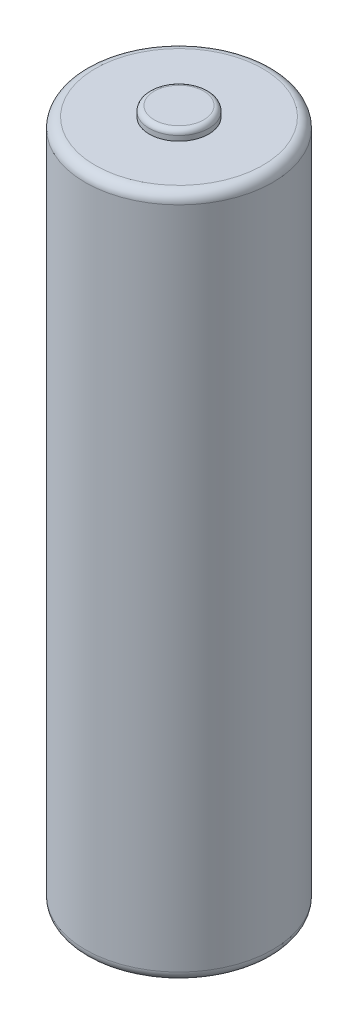
ISO-10303-21;
HEADER;
FILE_DESCRIPTION(('STEP AP214'),'2;1');
FILE_NAME('part.step','',(''),(''),'','','');
FILE_SCHEMA(('AUTOMOTIVE_DESIGN { 1 0 10303 214 1 1 1 1 }'));
ENDSEC;
DATA;
#1=APPLICATION_CONTEXT('core data for automotive mechanical design processes');
#2=APPLICATION_PROTOCOL_DEFINITION('international standard','automotive_design',2000,#1);
#3=PRODUCT_CONTEXT('',#1,'mechanical');
#4=PRODUCT('Part','Part','',(#3));
#5=PRODUCT_RELATED_PRODUCT_CATEGORY('part','',(#4));
#6=PRODUCT_DEFINITION_FORMATION('','',#4);
#7=PRODUCT_DEFINITION_CONTEXT('part definition',#1,'design');
#8=PRODUCT_DEFINITION('design','',#6,#7);
#9=PRODUCT_DEFINITION_SHAPE('','',#8);
#10=(LENGTH_UNIT() NAMED_UNIT(*) SI_UNIT(.MILLI.,.METRE.));
#11=(NAMED_UNIT(*) PLANE_ANGLE_UNIT() SI_UNIT($,.RADIAN.));
#12=(NAMED_UNIT(*) SI_UNIT($,.STERADIAN.) SOLID_ANGLE_UNIT());
#13=UNCERTAINTY_MEASURE_WITH_UNIT(LENGTH_MEASURE(1.E-05),#10,'distance_accuracy_value','');
#14=(GEOMETRIC_REPRESENTATION_CONTEXT(3) GLOBAL_UNCERTAINTY_ASSIGNED_CONTEXT((#13)) GLOBAL_UNIT_ASSIGNED_CONTEXT((#10,
#11,#12)) REPRESENTATION_CONTEXT('',''));
#15=CARTESIAN_POINT('',(0.,0.,0.));
#16=DIRECTION('',(0.,0.,1.));
#17=DIRECTION('',(1.,0.,0.));
#18=AXIS2_PLACEMENT_3D('',#15,#16,#17);
#19=CARTESIAN_POINT('',(0.,-35.,0.));
#20=DIRECTION('',(0.,1.,0.));
#21=DIRECTION('',(0.,0.,1.));
#22=AXIS2_PLACEMENT_3D('',#19,#20,#21);
#23=CYLINDRICAL_SURFACE('',#22,9.45);
#24=CARTESIAN_POINT('',(0.,-34.,0.));
#25=DIRECTION('',(0.,1.,0.));
#26=DIRECTION('',(0.,0.,1.));
#27=AXIS2_PLACEMENT_3D('',#24,#25,#26);
#28=CIRCLE('',#27,9.45);
#29=CARTESIAN_POINT('',(0.,-34.,9.45));
#30=VERTEX_POINT('',#29);
#31=EDGE_CURVE('E47',#30,#30,#28,.T.);
#32=ORIENTED_EDGE('',*,*,#31,.T.);
#33=EDGE_LOOP('',(#32));
#34=FACE_BOUND('',#33,.T.);
#35=CARTESIAN_POINT('',(0.,33.,0.));
#36=DIRECTION('',(0.,1.,0.));
#37=DIRECTION('',(0.,0.,1.));
#38=AXIS2_PLACEMENT_3D('',#35,#36,#37);
#39=CIRCLE('',#38,9.45);
#40=CARTESIAN_POINT('',(0.,33.,9.45));
#41=VERTEX_POINT('',#40);
#42=EDGE_CURVE('E51',#41,#41,#39,.F.);
#43=ORIENTED_EDGE('',*,*,#42,.T.);
#44=EDGE_LOOP('',(#43));
#45=FACE_BOUND('',#44,.T.);
#46=ADVANCED_FACE('F36',(#34,#45),#23,.T.);
#47=CARTESIAN_POINT('',(0.,-35.,0.));
#48=DIRECTION('',(0.,1.,0.));
#49=DIRECTION('',(0.,0.,1.));
#50=AXIS2_PLACEMENT_3D('',#47,#48,#49);
#51=PLANE('',#50);
#52=CARTESIAN_POINT('',(0.,-35.,0.));
#53=DIRECTION('',(0.,1.,0.));
#54=DIRECTION('',(0.,0.,1.));
#55=AXIS2_PLACEMENT_3D('',#52,#53,#54);
#56=CIRCLE('',#55,8.45);
#57=CARTESIAN_POINT('',(0.,-35.,8.45));
#58=VERTEX_POINT('',#57);
#59=EDGE_CURVE('E43',#58,#58,#56,.F.);
#60=ORIENTED_EDGE('',*,*,#59,.T.);
#61=EDGE_LOOP('',(#60));
#62=FACE_BOUND('',#61,.T.);
#63=ADVANCED_FACE('F70',(#62),#51,.F.);
#64=CARTESIAN_POINT('',(0.,34.,0.));
#65=DIRECTION('',(0.,1.,0.));
#66=DIRECTION('',(0.,0.,1.));
#67=AXIS2_PLACEMENT_3D('',#64,#65,#66);
#68=PLANE('',#67);
#69=CARTESIAN_POINT('',(0.,34.,0.));
#70=DIRECTION('',(0.,1.,0.));
#71=DIRECTION('',(0.,0.,1.));
#72=AXIS2_PLACEMENT_3D('',#69,#70,#71);
#73=CIRCLE('',#72,8.45);
#74=CARTESIAN_POINT('',(0.,34.,8.45));
#75=VERTEX_POINT('',#74);
#76=EDGE_CURVE('E10',#75,#75,#73,.T.);
#77=ORIENTED_EDGE('',*,*,#76,.T.);
#78=EDGE_LOOP('',(#77));
#79=FACE_BOUND('',#78,.T.);
#80=CARTESIAN_POINT('',(0.,34.,0.));
#81=DIRECTION('',(0.,1.,0.));
#82=DIRECTION('',(0.,0.,1.));
#83=AXIS2_PLACEMENT_3D('',#80,#81,#82);
#84=CIRCLE('',#83,3.);
#85=CARTESIAN_POINT('',(0.,34.,3.));
#86=VERTEX_POINT('',#85);
#87=EDGE_CURVE('E62',#86,#86,#84,.T.);
#88=ORIENTED_EDGE('',*,*,#87,.F.);
#89=EDGE_LOOP('',(#88));
#90=FACE_BOUND('',#89,.T.);
#91=ADVANCED_FACE('F68',(#79,#90),#68,.T.);
#92=CARTESIAN_POINT('',(0.,34.,0.));
#93=DIRECTION('',(0.,1.,0.));
#94=DIRECTION('',(0.,0.,1.));
#95=AXIS2_PLACEMENT_3D('',#92,#93,#94);
#96=CYLINDRICAL_SURFACE('',#95,3.);
#97=CARTESIAN_POINT('',(0.,34.5,0.));
#98=DIRECTION('',(0.,1.,0.));
#99=DIRECTION('',(0.,0.,1.));
#100=AXIS2_PLACEMENT_3D('',#97,#98,#99);
#101=CIRCLE('',#100,3.);
#102=CARTESIAN_POINT('',(0.,34.5,3.));
#103=VERTEX_POINT('',#102);
#104=EDGE_CURVE('E56',#103,#103,#101,.F.);
#105=ORIENTED_EDGE('',*,*,#104,.T.);
#106=EDGE_LOOP('',(#105));
#107=FACE_BOUND('',#106,.T.);
#108=ORIENTED_EDGE('',*,*,#87,.T.);
#109=EDGE_LOOP('',(#108));
#110=FACE_BOUND('',#109,.T.);
#111=ADVANCED_FACE('F66',(#107,#110),#96,.T.);
#112=CARTESIAN_POINT('',(0.,35.,0.));
#113=DIRECTION('',(0.,1.,0.));
#114=DIRECTION('',(0.,0.,1.));
#115=AXIS2_PLACEMENT_3D('',#112,#113,#114);
#116=PLANE('',#115);
#117=CARTESIAN_POINT('',(0.,35.,0.));
#118=DIRECTION('',(0.,1.,0.));
#119=DIRECTION('',(0.,0.,1.));
#120=AXIS2_PLACEMENT_3D('',#117,#118,#119);
#121=CIRCLE('',#120,2.5);
#122=CARTESIAN_POINT('',(0.,35.,2.5));
#123=VERTEX_POINT('',#122);
#124=EDGE_CURVE('E59',#123,#123,#121,.T.);
#125=ORIENTED_EDGE('',*,*,#124,.T.);
#126=EDGE_LOOP('',(#125));
#127=FACE_BOUND('',#126,.T.);
#128=ADVANCED_FACE('F76',(#127),#116,.T.);
#129=CARTESIAN_POINT('',(0.,34.5,0.));
#130=DIRECTION('',(0.,1.,0.));
#131=DIRECTION('',(0.,0.,1.));
#132=AXIS2_PLACEMENT_3D('',#129,#130,#131);
#133=TOROIDAL_SURFACE('',#132,2.5,0.5);
#134=ORIENTED_EDGE('',*,*,#104,.F.);
#135=EDGE_LOOP('',(#134));
#136=FACE_BOUND('',#135,.T.);
#137=ORIENTED_EDGE('',*,*,#124,.F.);
#138=EDGE_LOOP('',(#137));
#139=FACE_BOUND('',#138,.T.);
#140=ADVANCED_FACE('F88',(#136,#139),#133,.T.);
#141=CARTESIAN_POINT('',(0.,-34.,0.));
#142=DIRECTION('',(0.,1.,0.));
#143=DIRECTION('',(0.,0.,1.));
#144=AXIS2_PLACEMENT_3D('',#141,#142,#143);
#145=TOROIDAL_SURFACE('',#144,8.45,1.);
#146=ORIENTED_EDGE('',*,*,#59,.F.);
#147=EDGE_LOOP('',(#146));
#148=FACE_BOUND('',#147,.T.);
#149=ORIENTED_EDGE('',*,*,#31,.F.);
#150=EDGE_LOOP('',(#149));
#151=FACE_BOUND('',#150,.T.);
#152=ADVANCED_FACE('F90',(#148,#151),#145,.T.);
#153=CARTESIAN_POINT('',(0.,33.,0.));
#154=DIRECTION('',(0.,1.,0.));
#155=DIRECTION('',(0.,0.,1.));
#156=AXIS2_PLACEMENT_3D('',#153,#154,#155);
#157=TOROIDAL_SURFACE('',#156,8.45,1.);
#158=ORIENTED_EDGE('',*,*,#42,.F.);
#159=EDGE_LOOP('',(#158));
#160=FACE_BOUND('',#159,.T.);
#161=ORIENTED_EDGE('',*,*,#76,.F.);
#162=EDGE_LOOP('',(#161));
#163=FACE_BOUND('',#162,.T.);
#164=ADVANCED_FACE('F38',(#160,#163),#157,.T.);
#165=CLOSED_SHELL('',(#46,#63,#91,#111,#128,#140,#152,#164));
#166=MANIFOLD_SOLID_BREP('B2',#165);
#167=ADVANCED_BREP_SHAPE_REPRESENTATION('',(#18,#166),#14);
#168=SHAPE_DEFINITION_REPRESENTATION(#9,#167);
ENDSEC;
END-ISO-10303-21;
